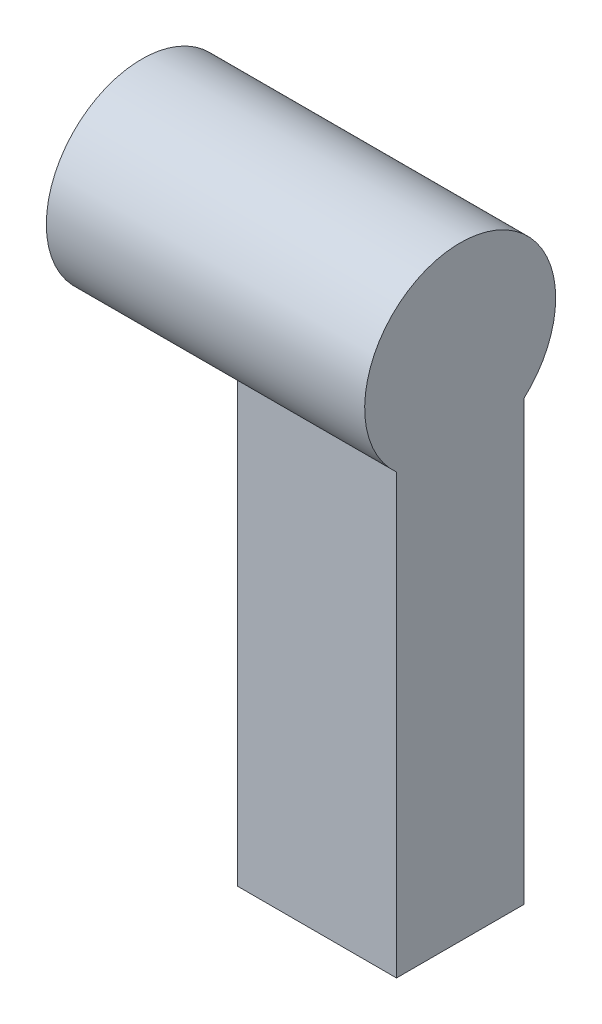
ISO-10303-21;
HEADER;
FILE_DESCRIPTION(('STEP AP214'),'2;1');
FILE_NAME('part.step','',(''),(''),'','','');
FILE_SCHEMA(('AUTOMOTIVE_DESIGN { 1 0 10303 214 1 1 1 1 }'));
ENDSEC;
DATA;
#1=APPLICATION_CONTEXT('core data for automotive mechanical design processes');
#2=APPLICATION_PROTOCOL_DEFINITION('international standard','automotive_design',2000,#1);
#3=PRODUCT_CONTEXT('',#1,'mechanical');
#4=PRODUCT('Part','Part','',(#3));
#5=PRODUCT_RELATED_PRODUCT_CATEGORY('part','',(#4));
#6=PRODUCT_DEFINITION_FORMATION('','',#4);
#7=PRODUCT_DEFINITION_CONTEXT('part definition',#1,'design');
#8=PRODUCT_DEFINITION('design','',#6,#7);
#9=PRODUCT_DEFINITION_SHAPE('','',#8);
#10=(LENGTH_UNIT() NAMED_UNIT(*) SI_UNIT(.MILLI.,.METRE.));
#11=(NAMED_UNIT(*) PLANE_ANGLE_UNIT() SI_UNIT($,.RADIAN.));
#12=(NAMED_UNIT(*) SI_UNIT($,.STERADIAN.) SOLID_ANGLE_UNIT());
#13=UNCERTAINTY_MEASURE_WITH_UNIT(LENGTH_MEASURE(1.E-05),#10,'distance_accuracy_value','');
#14=(GEOMETRIC_REPRESENTATION_CONTEXT(3) GLOBAL_UNCERTAINTY_ASSIGNED_CONTEXT((#13)) GLOBAL_UNIT_ASSIGNED_CONTEXT((#10,
#11,#12)) REPRESENTATION_CONTEXT('',''));
#15=CARTESIAN_POINT('',(0.,0.,0.));
#16=DIRECTION('',(0.,0.,1.));
#17=DIRECTION('',(1.,0.,0.));
#18=AXIS2_PLACEMENT_3D('',#15,#16,#17);
#19=CARTESIAN_POINT('',(-50.,0.,0.));
#20=DIRECTION('',(1.,0.,0.));
#21=DIRECTION('',(0.,0.,-1.));
#22=AXIS2_PLACEMENT_3D('',#19,#20,#21);
#23=CYLINDRICAL_SURFACE('',#22,15.);
#24=DIRECTION('',(1.,0.,0.));
#25=VECTOR('',#24,1.);
#26=CARTESIAN_POINT('',(-50.,-11.1803398874989,10.));
#27=LINE('',#26,#25);
#28=CARTESIAN_POINT('',(0.,-11.180339887499,10.));
#29=VERTEX_POINT('',#28);
#30=CARTESIAN_POINT('',(-25.,-11.1803398874989,10.));
#31=VERTEX_POINT('',#30);
#32=EDGE_CURVE('E107',#29,#31,#27,.F.);
#33=ORIENTED_EDGE('',*,*,#32,.F.);
#34=CARTESIAN_POINT('',(0.,0.,0.));
#35=DIRECTION('',(1.,0.,0.));
#36=DIRECTION('',(0.,0.,-1.));
#37=AXIS2_PLACEMENT_3D('',#34,#35,#36);
#38=CIRCLE('',#37,15.);
#39=CARTESIAN_POINT('',(0.,-11.1803398874989,-10.));
#40=VERTEX_POINT('',#39);
#41=EDGE_CURVE('E109',#40,#29,#38,.T.);
#42=ORIENTED_EDGE('',*,*,#41,.F.);
#43=DIRECTION('',(1.,0.,0.));
#44=VECTOR('',#43,1.);
#45=CARTESIAN_POINT('',(-50.,-11.180339887499,-9.99999999999999));
#46=LINE('',#45,#44);
#47=CARTESIAN_POINT('',(-25.,-11.180339887499,-9.99999999999999));
#48=VERTEX_POINT('',#47);
#49=EDGE_CURVE('E49',#48,#40,#46,.T.);
#50=ORIENTED_EDGE('',*,*,#49,.F.);
#51=CARTESIAN_POINT('',(-25.,0.,0.));
#52=DIRECTION('',(-1.,0.,0.));
#53=DIRECTION('',(0.,0.,1.));
#54=AXIS2_PLACEMENT_3D('',#51,#52,#53);
#55=CIRCLE('',#54,15.);
#56=EDGE_CURVE('E11',#31,#48,#55,.F.);
#57=ORIENTED_EDGE('',*,*,#56,.F.);
#58=EDGE_LOOP('',(#33,#42,#50,#57));
#59=FACE_BOUND('',#58,.T.);
#60=CARTESIAN_POINT('',(-50.,0.,0.));
#61=DIRECTION('',(1.,0.,0.));
#62=DIRECTION('',(0.,0.,-1.));
#63=AXIS2_PLACEMENT_3D('',#60,#61,#62);
#64=CIRCLE('',#63,15.);
#65=CARTESIAN_POINT('',(-50.,0.,-15.));
#66=VERTEX_POINT('',#65);
#67=EDGE_CURVE('E39',#66,#66,#64,.T.);
#68=ORIENTED_EDGE('',*,*,#67,.T.);
#69=EDGE_LOOP('',(#68));
#70=FACE_BOUND('',#69,.T.);
#71=ADVANCED_FACE('F32',(#59,#70),#23,.T.);
#72=CARTESIAN_POINT('',(-50.,0.,0.));
#73=DIRECTION('',(1.,0.,0.));
#74=DIRECTION('',(0.,0.,-1.));
#75=AXIS2_PLACEMENT_3D('',#72,#73,#74);
#76=PLANE('',#75);
#77=ORIENTED_EDGE('',*,*,#67,.F.);
#78=EDGE_LOOP('',(#77));
#79=FACE_BOUND('',#78,.T.);
#80=ADVANCED_FACE('F124',(#79),#76,.F.);
#81=CARTESIAN_POINT('',(0.,0.,0.));
#82=DIRECTION('',(1.,0.,0.));
#83=DIRECTION('',(0.,0.,-1.));
#84=AXIS2_PLACEMENT_3D('',#81,#82,#83);
#85=PLANE('',#84);
#86=ORIENTED_EDGE('',*,*,#41,.T.);
#87=DIRECTION('',(0.,1.,0.));
#88=VECTOR('',#87,1.);
#89=CARTESIAN_POINT('',(0.,-80.,10.));
#90=LINE('',#89,#88);
#91=CARTESIAN_POINT('',(0.,-80.,10.));
#92=VERTEX_POINT('',#91);
#93=EDGE_CURVE('E91',#92,#29,#90,.T.);
#94=ORIENTED_EDGE('',*,*,#93,.F.);
#95=DIRECTION('',(0.,0.,-1.));
#96=VECTOR('',#95,1.);
#97=CARTESIAN_POINT('',(0.,-80.,-10.));
#98=LINE('',#97,#96);
#99=CARTESIAN_POINT('',(0.,-80.,-10.));
#100=VERTEX_POINT('',#99);
#101=EDGE_CURVE('E84',#92,#100,#98,.T.);
#102=ORIENTED_EDGE('',*,*,#101,.T.);
#103=DIRECTION('',(0.,1.,0.));
#104=VECTOR('',#103,1.);
#105=CARTESIAN_POINT('',(0.,-80.,-10.));
#106=LINE('',#105,#104);
#107=EDGE_CURVE('E68',#100,#40,#106,.T.);
#108=ORIENTED_EDGE('',*,*,#107,.T.);
#109=EDGE_LOOP('',(#86,#94,#102,#108));
#110=FACE_BOUND('',#109,.T.);
#111=ADVANCED_FACE('F89',(#110),#85,.T.);
#112=CARTESIAN_POINT('',(0.,-80.,10.));
#113=DIRECTION('',(0.,0.,1.));
#114=DIRECTION('',(1.,0.,0.));
#115=AXIS2_PLACEMENT_3D('',#112,#113,#114);
#116=PLANE('',#115);
#117=ORIENTED_EDGE('',*,*,#93,.T.);
#118=ORIENTED_EDGE('',*,*,#32,.T.);
#119=DIRECTION('',(0.,1.,0.));
#120=VECTOR('',#119,1.);
#121=CARTESIAN_POINT('',(-25.,-80.,10.));
#122=LINE('',#121,#120);
#123=CARTESIAN_POINT('',(-25.,-80.,10.));
#124=VERTEX_POINT('',#123);
#125=EDGE_CURVE('E102',#124,#31,#122,.T.);
#126=ORIENTED_EDGE('',*,*,#125,.F.);
#127=DIRECTION('',(1.,0.,0.));
#128=VECTOR('',#127,1.);
#129=CARTESIAN_POINT('',(0.,-80.,10.));
#130=LINE('',#129,#128);
#131=EDGE_CURVE('E77',#124,#92,#130,.T.);
#132=ORIENTED_EDGE('',*,*,#131,.T.);
#133=EDGE_LOOP('',(#117,#118,#126,#132));
#134=FACE_BOUND('',#133,.T.);
#135=ADVANCED_FACE('F112',(#134),#116,.T.);
#136=CARTESIAN_POINT('',(-25.,-80.,-10.));
#137=DIRECTION('',(-1.,0.,0.));
#138=DIRECTION('',(0.,0.,1.));
#139=AXIS2_PLACEMENT_3D('',#136,#137,#138);
#140=PLANE('',#139);
#141=ORIENTED_EDGE('',*,*,#125,.T.);
#142=ORIENTED_EDGE('',*,*,#56,.T.);
#143=DIRECTION('',(0.,1.,0.));
#144=VECTOR('',#143,1.);
#145=CARTESIAN_POINT('',(-25.,-80.,-10.));
#146=LINE('',#145,#144);
#147=CARTESIAN_POINT('',(-25.,-80.,-10.));
#148=VERTEX_POINT('',#147);
#149=EDGE_CURVE('E76',#148,#48,#146,.T.);
#150=ORIENTED_EDGE('',*,*,#149,.F.);
#151=DIRECTION('',(0.,0.,1.));
#152=VECTOR('',#151,1.);
#153=CARTESIAN_POINT('',(-25.,-80.,-10.));
#154=LINE('',#153,#152);
#155=EDGE_CURVE('E87',#148,#124,#154,.T.);
#156=ORIENTED_EDGE('',*,*,#155,.T.);
#157=EDGE_LOOP('',(#141,#142,#150,#156));
#158=FACE_BOUND('',#157,.T.);
#159=ADVANCED_FACE('F114',(#158),#140,.T.);
#160=CARTESIAN_POINT('',(0.,-80.,-10.));
#161=DIRECTION('',(0.,0.,-1.));
#162=DIRECTION('',(-1.,0.,0.));
#163=AXIS2_PLACEMENT_3D('',#160,#161,#162);
#164=PLANE('',#163);
#165=ORIENTED_EDGE('',*,*,#149,.T.);
#166=ORIENTED_EDGE('',*,*,#49,.T.);
#167=ORIENTED_EDGE('',*,*,#107,.F.);
#168=DIRECTION('',(-1.,0.,0.));
#169=VECTOR('',#168,1.);
#170=CARTESIAN_POINT('',(0.,-80.,-10.));
#171=LINE('',#170,#169);
#172=EDGE_CURVE('E72',#100,#148,#171,.T.);
#173=ORIENTED_EDGE('',*,*,#172,.T.);
#174=EDGE_LOOP('',(#165,#166,#167,#173));
#175=FACE_BOUND('',#174,.T.);
#176=ADVANCED_FACE('F71',(#175),#164,.T.);
#177=CARTESIAN_POINT('',(0.,-80.,0.));
#178=DIRECTION('',(0.,-1.,0.));
#179=DIRECTION('',(0.,0.,-1.));
#180=AXIS2_PLACEMENT_3D('',#177,#178,#179);
#181=PLANE('',#180);
#182=CARTESIAN_POINT('',(-12.5,-80.,0.));
#183=DIRECTION('',(0.,-1.,0.));
#184=DIRECTION('',(0.,0.,-1.));
#185=AXIS2_PLACEMENT_3D('',#182,#183,#184);
#186=CIRCLE('',#185,9.);
#187=CARTESIAN_POINT('',(-12.5,-80.,-9.));
#188=VERTEX_POINT('',#187);
#189=EDGE_CURVE('E95',#188,#188,#186,.T.);
#190=ORIENTED_EDGE('',*,*,#189,.F.);
#191=EDGE_LOOP('',(#190));
#192=FACE_BOUND('',#191,.T.);
#193=ORIENTED_EDGE('',*,*,#101,.F.);
#194=ORIENTED_EDGE('',*,*,#131,.F.);
#195=ORIENTED_EDGE('',*,*,#155,.F.);
#196=ORIENTED_EDGE('',*,*,#172,.F.);
#197=EDGE_LOOP('',(#193,#194,#195,#196));
#198=FACE_BOUND('',#197,.T.);
#199=ADVANCED_FACE('F82',(#192,#198),#181,.T.);
#200=CARTESIAN_POINT('',(-12.5,-70.,0.));
#201=DIRECTION('',(0.,-1.,0.));
#202=DIRECTION('',(0.,0.,-1.));
#203=AXIS2_PLACEMENT_3D('',#200,#201,#202);
#204=CYLINDRICAL_SURFACE('',#203,9.);
#205=CARTESIAN_POINT('',(-12.5,-70.,0.));
#206=DIRECTION('',(0.,-1.,0.));
#207=DIRECTION('',(0.,0.,-1.));
#208=AXIS2_PLACEMENT_3D('',#205,#206,#207);
#209=CIRCLE('',#208,9.);
#210=CARTESIAN_POINT('',(-12.5,-70.,-9.));
#211=VERTEX_POINT('',#210);
#212=EDGE_CURVE('E92',#211,#211,#209,.T.);
#213=ORIENTED_EDGE('',*,*,#212,.F.);
#214=EDGE_LOOP('',(#213));
#215=FACE_BOUND('',#214,.T.);
#216=ORIENTED_EDGE('',*,*,#189,.T.);
#217=EDGE_LOOP('',(#216));
#218=FACE_BOUND('',#217,.T.);
#219=ADVANCED_FACE('F160',(#215,#218),#204,.F.);
#220=CARTESIAN_POINT('',(-12.5,-70.,0.));
#221=DIRECTION('',(0.,-1.,0.));
#222=DIRECTION('',(0.,0.,-1.));
#223=AXIS2_PLACEMENT_3D('',#220,#221,#222);
#224=PLANE('',#223);
#225=ORIENTED_EDGE('',*,*,#212,.T.);
#226=EDGE_LOOP('',(#225));
#227=FACE_BOUND('',#226,.T.);
#228=ADVANCED_FACE('F170',(#227),#224,.T.);
#229=CLOSED_SHELL('',(#71,#80,#111,#135,#159,#176,#199,#219,#228));
#230=MANIFOLD_SOLID_BREP('B2',#229);
#231=ADVANCED_BREP_SHAPE_REPRESENTATION('',(#18,#230),#14);
#232=SHAPE_DEFINITION_REPRESENTATION(#9,#231);
ENDSEC;
END-ISO-10303-21;
